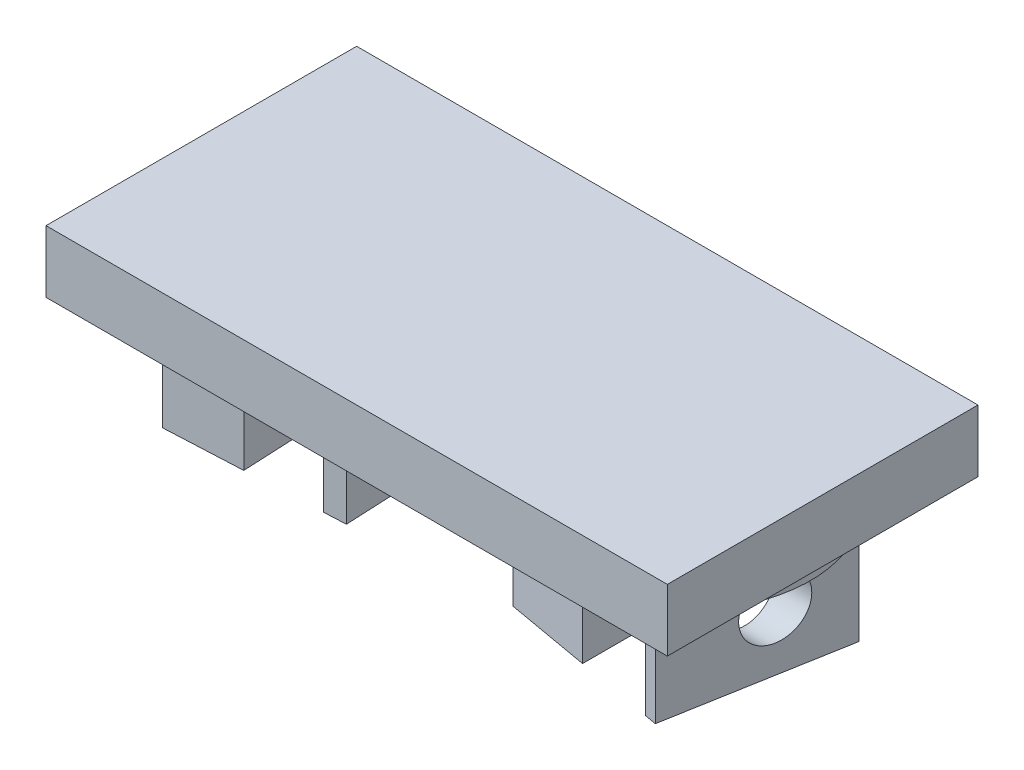
ISO-10303-21;
HEADER;
FILE_DESCRIPTION(('STEP AP214'),'2;1');
FILE_NAME('part.step','',(''),(''),'','','');
FILE_SCHEMA(('AUTOMOTIVE_DESIGN { 1 0 10303 214 1 1 1 1 }'));
ENDSEC;
DATA;
#1=APPLICATION_CONTEXT('core data for automotive mechanical design processes');
#2=APPLICATION_PROTOCOL_DEFINITION('international standard','automotive_design',2000,#1);
#3=PRODUCT_CONTEXT('',#1,'mechanical');
#4=PRODUCT('Part','Part','',(#3));
#5=PRODUCT_RELATED_PRODUCT_CATEGORY('part','',(#4));
#6=PRODUCT_DEFINITION_FORMATION('','',#4);
#7=PRODUCT_DEFINITION_CONTEXT('part definition',#1,'design');
#8=PRODUCT_DEFINITION('design','',#6,#7);
#9=PRODUCT_DEFINITION_SHAPE('','',#8);
#10=(LENGTH_UNIT() NAMED_UNIT(*) SI_UNIT(.MILLI.,.METRE.));
#11=(NAMED_UNIT(*) PLANE_ANGLE_UNIT() SI_UNIT($,.RADIAN.));
#12=(NAMED_UNIT(*) SI_UNIT($,.STERADIAN.) SOLID_ANGLE_UNIT());
#13=UNCERTAINTY_MEASURE_WITH_UNIT(LENGTH_MEASURE(1.E-05),#10,'distance_accuracy_value','');
#14=(GEOMETRIC_REPRESENTATION_CONTEXT(3) GLOBAL_UNCERTAINTY_ASSIGNED_CONTEXT((#13)) GLOBAL_UNIT_ASSIGNED_CONTEXT((#10,
#11,#12)) REPRESENTATION_CONTEXT('',''));
#15=CARTESIAN_POINT('',(0.,0.,0.));
#16=DIRECTION('',(0.,0.,1.));
#17=DIRECTION('',(1.,0.,0.));
#18=AXIS2_PLACEMENT_3D('',#15,#16,#17);
#19=CARTESIAN_POINT('',(-0.784116768757083,-14.5,-16.3224058618479));
#20=DIRECTION('',(0.0479839526443447,0.,0.998848106715243));
#21=DIRECTION('',(0.998848106715243,0.,-0.0479839526443447));
#22=AXIS2_PLACEMENT_3D('',#19,#20,#21);
#23=PLANE('',#22);
#24=DIRECTION('',(0.,-1.,0.));
#25=VECTOR('',#24,1.);
#26=CARTESIAN_POINT('',(31.9470151256708,-13.,-17.8947861589713));
#27=LINE('',#26,#25);
#28=CARTESIAN_POINT('',(31.9470151256708,-13.,-17.8947861589713));
#29=VERTEX_POINT('',#28);
#30=CARTESIAN_POINT('',(31.9470151256708,-29.,-17.8947861589713));
#31=VERTEX_POINT('',#30);
#32=EDGE_CURVE('E209',#29,#31,#27,.T.);
#33=ORIENTED_EDGE('',*,*,#32,.F.);
#34=DIRECTION('',(0.998848106715243,0.,-0.0479839526443447));
#35=VECTOR('',#34,1.);
#36=CARTESIAN_POINT('',(-0.784116768757083,-13.,-16.3224058618479));
#37=LINE('',#36,#35);
#38=CARTESIAN_POINT('',(35.4472498266149,-13.,-18.0629349445625));
#39=VERTEX_POINT('',#38);
#40=EDGE_CURVE('E286',#29,#39,#37,.T.);
#41=ORIENTED_EDGE('',*,*,#40,.T.);
#42=DIRECTION('',(0.,1.,0.));
#43=VECTOR('',#42,1.);
#44=CARTESIAN_POINT('',(35.4472498266149,-14.5,-18.0629349445625));
#45=LINE('',#44,#43);
#46=CARTESIAN_POINT('',(35.4472498266149,-29.,-18.0629349445625));
#47=VERTEX_POINT('',#46);
#48=EDGE_CURVE('E299',#47,#39,#45,.T.);
#49=ORIENTED_EDGE('',*,*,#48,.F.);
#50=DIRECTION('',(0.998848106715243,0.,-0.0479839526443449));
#51=VECTOR('',#50,1.);
#52=CARTESIAN_POINT('',(7.19555904126711,-29.,-16.7057438124444));
#53=LINE('',#52,#51);
#54=EDGE_CURVE('E234',#31,#47,#53,.T.);
#55=ORIENTED_EDGE('',*,*,#54,.F.);
#56=EDGE_LOOP('',(#33,#41,#49,#55));
#57=FACE_BOUND('',#56,.T.);
#58=ADVANCED_FACE('F41',(#57),#23,.F.);
#59=CARTESIAN_POINT('',(36.8044409587329,-29.,10.1887558407852));
#60=DIRECTION('',(-0.0479839526443453,0.,-0.998848106715243));
#61=DIRECTION('',(-0.998848106715243,0.,0.0479839526443453));
#62=AXIS2_PLACEMENT_3D('',#59,#60,#61);
#63=PLANE('',#62);
#64=DIRECTION('',(0.,1.,0.));
#65=VECTOR('',#64,1.);
#66=CARTESIAN_POINT('',(33.3042062577889,-29.,10.3569046263763));
#67=LINE('',#66,#65);
#68=CARTESIAN_POINT('',(33.3042062577889,-29.,10.3569046263763));
#69=VERTEX_POINT('',#68);
#70=CARTESIAN_POINT('',(33.3042062577889,-14.5,10.3569046263763));
#71=VERTEX_POINT('',#70);
#72=EDGE_CURVE('E206',#69,#71,#67,.T.);
#73=ORIENTED_EDGE('',*,*,#72,.F.);
#74=DIRECTION('',(-0.998848106715243,0.,0.0479839526443453));
#75=VECTOR('',#74,1.);
#76=CARTESIAN_POINT('',(36.8044409587329,-29.,10.1887558407852));
#77=LINE('',#76,#75);
#78=CARTESIAN_POINT('',(36.8044409587329,-29.,10.1887558407852));
#79=VERTEX_POINT('',#78);
#80=EDGE_CURVE('E221',#79,#69,#77,.T.);
#81=ORIENTED_EDGE('',*,*,#80,.F.);
#82=DIRECTION('',(0.,1.,0.));
#83=VECTOR('',#82,1.);
#84=CARTESIAN_POINT('',(36.8044409587329,-29.,10.1887558407852));
#85=LINE('',#84,#83);
#86=CARTESIAN_POINT('',(36.8044409587329,-14.5,10.1887558407852));
#87=VERTEX_POINT('',#86);
#88=EDGE_CURVE('E244',#79,#87,#85,.T.);
#89=ORIENTED_EDGE('',*,*,#88,.T.);
#90=DIRECTION('',(-0.998848106715243,0.,0.0479839526443453));
#91=VECTOR('',#90,1.);
#92=CARTESIAN_POINT('',(36.8044409587329,-14.5,10.1887558407852));
#93=LINE('',#92,#91);
#94=EDGE_CURVE('E223',#87,#71,#93,.T.);
#95=ORIENTED_EDGE('',*,*,#94,.T.);
#96=EDGE_LOOP('',(#73,#81,#89,#95));
#97=FACE_BOUND('',#96,.T.);
#98=ADVANCED_FACE('F219',(#97),#63,.F.);
#99=CARTESIAN_POINT('',(0.,-29.,0.));
#100=DIRECTION('',(0.,-1.,0.));
#101=DIRECTION('',(0.,0.,-1.));
#102=AXIS2_PLACEMENT_3D('',#99,#100,#101);
#103=PLANE('',#102);
#104=ORIENTED_EDGE('',*,*,#80,.T.);
#105=DIRECTION('',(0.0479839526443449,0.,0.998848106715243));
#106=VECTOR('',#105,1.);
#107=CARTESIAN_POINT('',(31.9470151256708,-29.,-17.8947861589713));
#108=LINE('',#107,#106);
#109=EDGE_CURVE('E203',#31,#69,#108,.T.);
#110=ORIENTED_EDGE('',*,*,#109,.F.);
#111=ORIENTED_EDGE('',*,*,#54,.T.);
#112=DIRECTION('',(0.047983952644345,0.,0.998848106715243));
#113=VECTOR('',#112,1.);
#114=CARTESIAN_POINT('',(35.4472498266149,-29.,-18.0629349445625));
#115=LINE('',#114,#113);
#116=EDGE_CURVE('E228',#47,#79,#115,.T.);
#117=ORIENTED_EDGE('',*,*,#116,.T.);
#118=EDGE_LOOP('',(#104,#110,#111,#117));
#119=FACE_BOUND('',#118,.T.);
#120=ADVANCED_FACE('F226',(#119),#103,.T.);
#121=CARTESIAN_POINT('',(0.466417402178967,-14.5,-2.63262201240728));
#122=DIRECTION('',(0.174451643781529,0.,-0.984665742260754));
#123=DIRECTION('',(-0.984665742260755,0.,-0.174451643781529));
#124=AXIS2_PLACEMENT_3D('',#121,#122,#123);
#125=PLANE('',#124);
#126=DIRECTION('',(0.,-1.,0.));
#127=VECTOR('',#126,1.);
#128=CARTESIAN_POINT('',(75.22,-14.5,10.6113498280335));
#129=LINE('',#128,#127);
#130=CARTESIAN_POINT('',(75.22,-13.,10.6113498280335));
#131=VERTEX_POINT('',#130);
#132=CARTESIAN_POINT('',(75.22,-29.,10.6113498280335));
#133=VERTEX_POINT('',#132);
#134=EDGE_CURVE('E362',#131,#133,#129,.T.);
#135=ORIENTED_EDGE('',*,*,#134,.F.);
#136=DIRECTION('',(-0.984665742260755,0.,-0.174451643781529));
#137=VECTOR('',#136,1.);
#138=CARTESIAN_POINT('',(0.466417402178967,-13.,-2.63262201240728));
#139=LINE('',#138,#137);
#140=CARTESIAN_POINT('',(61.6076047227655,-13.,8.19966367912247));
#141=VERTEX_POINT('',#140);
#142=EDGE_CURVE('E254',#131,#141,#139,.T.);
#143=ORIENTED_EDGE('',*,*,#142,.T.);
#144=DIRECTION('',(0.,1.,0.));
#145=VECTOR('',#144,1.);
#146=CARTESIAN_POINT('',(61.6076047227655,-14.5,8.19966367912247));
#147=LINE('',#146,#145);
#148=CARTESIAN_POINT('',(61.6076047227655,-29.,8.19966367912247));
#149=VERTEX_POINT('',#148);
#150=EDGE_CURVE('E273',#149,#141,#147,.T.);
#151=ORIENTED_EDGE('',*,*,#150,.F.);
#152=DIRECTION('',(-0.984665742260755,0.,-0.174451643781528));
#153=VECTOR('',#152,1.);
#154=CARTESIAN_POINT('',(89.4581576649522,-29.,13.1339012914048));
#155=LINE('',#154,#153);
#156=EDGE_CURVE('E384',#133,#149,#155,.T.);
#157=ORIENTED_EDGE('',*,*,#156,.F.);
#158=EDGE_LOOP('',(#135,#143,#151,#157));
#159=FACE_BOUND('',#158,.T.);
#160=ADVANCED_FACE('F649',(#159),#125,.F.);
#161=CARTESIAN_POINT('',(6.27649815795352,-14.5,-31.999840083005));
#162=DIRECTION('',(-0.192474103402554,0.,0.981302053151517));
#163=DIRECTION('',(0.981302053151517,0.,0.192474103402554));
#164=AXIS2_PLACEMENT_3D('',#161,#162,#163);
#165=PLANE('',#164);
#166=DIRECTION('',(0.,1.,0.));
#167=VECTOR('',#166,1.);
#168=CARTESIAN_POINT('',(75.22,-14.5,-18.4771549323287));
#169=LINE('',#168,#167);
#170=CARTESIAN_POINT('',(75.22,-29.,-18.4771549323287));
#171=VERTEX_POINT('',#170);
#172=CARTESIAN_POINT('',(75.22,-13.,-18.4771549323287));
#173=VERTEX_POINT('',#172);
#174=EDGE_CURVE('E359',#171,#173,#169,.T.);
#175=ORIENTED_EDGE('',*,*,#174,.F.);
#176=DIRECTION('',(0.981302053151517,0.,0.192474103402554));
#177=VECTOR('',#176,1.);
#178=CARTESIAN_POINT('',(66.1138006423635,-29.,-20.2632589674085));
#179=LINE('',#178,#177);
#180=CARTESIAN_POINT('',(66.1138006423635,-29.,-20.2632589674085));
#181=VERTEX_POINT('',#180);
#182=EDGE_CURVE('E370',#181,#171,#179,.T.);
#183=ORIENTED_EDGE('',*,*,#182,.F.);
#184=DIRECTION('',(0.,1.,0.));
#185=VECTOR('',#184,1.);
#186=CARTESIAN_POINT('',(66.1138006423635,-14.5,-20.2632589674085));
#187=LINE('',#186,#185);
#188=CARTESIAN_POINT('',(66.1138006423635,-13.,-20.2632589674085));
#189=VERTEX_POINT('',#188);
#190=EDGE_CURVE('E270',#181,#189,#187,.T.);
#191=ORIENTED_EDGE('',*,*,#190,.T.);
#192=DIRECTION('',(0.981302053151517,0.,0.192474103402554));
#193=VECTOR('',#192,1.);
#194=CARTESIAN_POINT('',(6.27649815795352,-13.,-31.999840083005));
#195=LINE('',#194,#193);
#196=CARTESIAN_POINT('',(67.1504836630853,-13.,-20.0599223553172));
#197=VERTEX_POINT('',#196);
#198=EDGE_CURVE('E262',#189,#197,#195,.T.);
#199=ORIENTED_EDGE('',*,*,#198,.T.);
#200=EDGE_CURVE('E267',#197,#173,#195,.T.);
#201=ORIENTED_EDGE('',*,*,#200,.T.);
#202=EDGE_LOOP('',(#175,#183,#191,#199,#201));
#203=FACE_BOUND('',#202,.T.);
#204=ADVANCED_FACE('F369',(#203),#165,.F.);
#205=CARTESIAN_POINT('',(0.,-29.,0.));
#206=DIRECTION('',(0.,1.,0.));
#207=DIRECTION('',(0.,0.,1.));
#208=AXIS2_PLACEMENT_3D('',#205,#206,#207);
#209=PLANE('',#208);
#210=DIRECTION('',(0.,0.,-1.));
#211=VECTOR('',#210,1.);
#212=CARTESIAN_POINT('',(75.22,-29.,0.));
#213=LINE('',#212,#211);
#214=EDGE_CURVE('E50',#133,#171,#213,.T.);
#215=ORIENTED_EDGE('',*,*,#214,.F.);
#216=ORIENTED_EDGE('',*,*,#156,.T.);
#217=DIRECTION('',(0.156370546871228,0.,-0.987698462118471));
#218=VECTOR('',#217,1.);
#219=CARTESIAN_POINT('',(61.6076047227655,-29.,8.19966367912247));
#220=LINE('',#219,#218);
#221=EDGE_CURVE('E376',#149,#181,#220,.T.);
#222=ORIENTED_EDGE('',*,*,#221,.T.);
#223=ORIENTED_EDGE('',*,*,#182,.T.);
#224=EDGE_LOOP('',(#215,#216,#222,#223));
#225=FACE_BOUND('',#224,.T.);
#226=ADVANCED_FACE('F374',(#225),#209,.F.);
#227=CARTESIAN_POINT('',(0.,-13.,0.));
#228=DIRECTION('',(0.,-1.,0.));
#229=DIRECTION('',(0.,0.,-1.));
#230=AXIS2_PLACEMENT_3D('',#227,#228,#229);
#231=PLANE('',#230);
#232=DIRECTION('',(-0.174451643781528,0.,0.984665742260755));
#233=VECTOR('',#232,1.);
#234=CARTESIAN_POINT('',(88.9917402627732,-13.,15.7665233038121));
#235=LINE('',#234,#233);
#236=CARTESIAN_POINT('',(94.3923952772345,-13.,-14.7166516507817));
#237=VERTEX_POINT('',#236);
#238=CARTESIAN_POINT('',(89.4581576649522,-13.,13.1339012914048));
#239=VERTEX_POINT('',#238);
#240=EDGE_CURVE('E251',#237,#239,#235,.T.);
#241=ORIENTED_EDGE('',*,*,#240,.F.);
#242=CARTESIAN_POINT('',(78.,-13.,-3.25849398582963));
#243=DIRECTION('',(0.,-1.,0.));
#244=DIRECTION('',(0.,0.,-1.));
#245=AXIS2_PLACEMENT_3D('',#242,#243,#244);
#246=CIRCLE('',#245,20.);
#247=EDGE_CURVE('E306',#237,#239,#246,.T.);
#248=ORIENTED_EDGE('',*,*,#247,.T.);
#249=EDGE_LOOP('',(#241,#248));
#250=FACE_BOUND('',#249,.T.);
#251=ADVANCED_FACE('F524',(#250),#231,.T.);
#252=DIRECTION('',(0.156370546871227,0.,-0.987698462118471));
#253=VECTOR('',#252,1.);
#254=CARTESIAN_POINT('',(61.3676041369093,-13.,9.71560267339416));
#255=LINE('',#254,#253);
#256=CARTESIAN_POINT('',(65.9486051346585,-13.,-19.2198185486477));
#257=VERTEX_POINT('',#256);
#258=EDGE_CURVE('E259',#141,#257,#255,.T.);
#259=ORIENTED_EDGE('',*,*,#258,.F.);
#260=EDGE_CURVE('E815',#141,#257,#246,.T.);
#261=ORIENTED_EDGE('',*,*,#260,.T.);
#262=EDGE_LOOP('',(#259,#261));
#263=FACE_BOUND('',#262,.T.);
#264=ADVANCED_FACE('F518',(#263),#231,.T.);
#265=CARTESIAN_POINT('',(0.,-13.,0.));
#266=DIRECTION('',(0.,-1.,0.));
#267=DIRECTION('',(0.,0.,-1.));
#268=AXIS2_PLACEMENT_3D('',#265,#266,#267);
#269=PLANE('',#268);
#270=CARTESIAN_POINT('',(22.,-13.,-3.25849398582963));
#271=DIRECTION('',(0.,-1.,0.));
#272=DIRECTION('',(0.,0.,-1.));
#273=AXIS2_PLACEMENT_3D('',#270,#271,#272);
#274=CIRCLE('',#273,20.);
#275=CARTESIAN_POINT('',(36.8044409587329,-13.,10.1887558407852));
#276=VERTEX_POINT('',#275);
#277=CARTESIAN_POINT('',(8.55275017338513,-13.,11.5459469729032));
#278=VERTEX_POINT('',#277);
#279=EDGE_CURVE('E318',#276,#278,#274,.T.);
#280=ORIENTED_EDGE('',*,*,#279,.T.);
#281=DIRECTION('',(-1.,0.,0.));
#282=VECTOR('',#281,1.);
#283=CARTESIAN_POINT('',(38.28,-13.,11.5459469729032));
#284=LINE('',#283,#282);
#285=CARTESIAN_POINT('',(14.0534059063514,-13.,11.5459469729032));
#286=VERTEX_POINT('',#285);
#287=EDGE_CURVE('E396',#286,#278,#284,.T.);
#288=ORIENTED_EDGE('',*,*,#287,.F.);
#289=DIRECTION('',(0.998225432651283,0.,-0.0595481788819621));
#290=VECTOR('',#289,1.);
#291=CARTESIAN_POINT('',(0.736153204553354,-13.,12.3403748848396));
#292=LINE('',#291,#290);
#293=EDGE_CURVE('E283',#286,#276,#292,.T.);
#294=ORIENTED_EDGE('',*,*,#293,.T.);
#295=EDGE_LOOP('',(#280,#288,#294));
#296=FACE_BOUND('',#295,.T.);
#297=ADVANCED_FACE('F516',(#296),#269,.T.);
#298=DIRECTION('',(-0.0479839526443449,0.,-0.998848106715243));
#299=VECTOR('',#298,1.);
#300=CARTESIAN_POINT('',(7.9796758100242,-13.,-0.38333795059651));
#301=LINE('',#300,#299);
#302=CARTESIAN_POINT('',(7.19555904126712,-13.,-16.7057438124445));
#303=VERTEX_POINT('',#302);
#304=EDGE_CURVE('E279',#278,#303,#301,.T.);
#305=ORIENTED_EDGE('',*,*,#304,.F.);
#306=EDGE_CURVE('E462',#278,#303,#274,.T.);
#307=ORIENTED_EDGE('',*,*,#306,.T.);
#308=EDGE_LOOP('',(#305,#307));
#309=FACE_BOUND('',#308,.T.);
#310=ADVANCED_FACE('F461',(#309),#269,.T.);
#311=DIRECTION('',(0.047983952644345,0.,0.998848106715243));
#312=VECTOR('',#311,1.);
#313=CARTESIAN_POINT('',(36.231366595372,-13.,-1.74052908271453));
#314=LINE('',#313,#312);
#315=EDGE_CURVE('E290',#39,#276,#314,.T.);
#316=ORIENTED_EDGE('',*,*,#315,.F.);
#317=EDGE_CURVE('E314',#39,#276,#274,.T.);
#318=ORIENTED_EDGE('',*,*,#317,.T.);
#319=EDGE_LOOP('',(#316,#318));
#320=FACE_BOUND('',#319,.T.);
#321=ADVANCED_FACE('F476',(#320),#269,.T.);
#322=CARTESIAN_POINT('',(0.,-10.,21.7415060141704));
#323=DIRECTION('',(-1.,0.,0.));
#324=DIRECTION('',(0.,0.,1.));
#325=AXIS2_PLACEMENT_3D('',#322,#323,#324);
#326=PLANE('',#325);
#327=DIRECTION('',(0.,0.,1.));
#328=VECTOR('',#327,1.);
#329=CARTESIAN_POINT('',(0.,0.,21.7415060141704));
#330=LINE('',#329,#328);
#331=CARTESIAN_POINT('',(0.,0.,-28.2584939858296));
#332=VERTEX_POINT('',#331);
#333=CARTESIAN_POINT('',(0.,0.,21.7415060141704));
#334=VERTEX_POINT('',#333);
#335=EDGE_CURVE('E317',#332,#334,#330,.T.);
#336=ORIENTED_EDGE('',*,*,#335,.F.);
#337=DIRECTION('',(0.,1.,0.));
#338=VECTOR('',#337,1.);
#339=CARTESIAN_POINT('',(0.,-10.,-28.2584939858296));
#340=LINE('',#339,#338);
#341=CARTESIAN_POINT('',(0.,-10.,-28.2584939858296));
#342=VERTEX_POINT('',#341);
#343=EDGE_CURVE('E346',#342,#332,#340,.T.);
#344=ORIENTED_EDGE('',*,*,#343,.F.);
#345=DIRECTION('',(0.,0.,1.));
#346=VECTOR('',#345,1.);
#347=CARTESIAN_POINT('',(0.,-10.,21.7415060141704));
#348=LINE('',#347,#346);
#349=CARTESIAN_POINT('',(0.,-10.,21.7415060141704));
#350=VERTEX_POINT('',#349);
#351=EDGE_CURVE('E322',#342,#350,#348,.T.);
#352=ORIENTED_EDGE('',*,*,#351,.T.);
#353=DIRECTION('',(0.,1.,0.));
#354=VECTOR('',#353,1.);
#355=CARTESIAN_POINT('',(0.,-10.,21.7415060141704));
#356=LINE('',#355,#354);
#357=EDGE_CURVE('E335',#350,#334,#356,.T.);
#358=ORIENTED_EDGE('',*,*,#357,.T.);
#359=EDGE_LOOP('',(#336,#344,#352,#358));
#360=FACE_BOUND('',#359,.T.);
#361=ADVANCED_FACE('F43',(#360),#326,.T.);
#362=CARTESIAN_POINT('',(0.,-10.,-28.2584939858296));
#363=DIRECTION('',(0.,0.,-1.));
#364=DIRECTION('',(-1.,0.,0.));
#365=AXIS2_PLACEMENT_3D('',#362,#363,#364);
#366=PLANE('',#365);
#367=DIRECTION('',(-1.,0.,0.));
#368=VECTOR('',#367,1.);
#369=CARTESIAN_POINT('',(0.,0.,-28.2584939858296));
#370=LINE('',#369,#368);
#371=CARTESIAN_POINT('',(100.,0.,-28.2584939858296));
#372=VERTEX_POINT('',#371);
#373=EDGE_CURVE('E326',#372,#332,#370,.T.);
#374=ORIENTED_EDGE('',*,*,#373,.F.);
#375=DIRECTION('',(0.,1.,0.));
#376=VECTOR('',#375,1.);
#377=CARTESIAN_POINT('',(100.,-10.,-28.2584939858296));
#378=LINE('',#377,#376);
#379=CARTESIAN_POINT('',(100.,-10.,-28.2584939858296));
#380=VERTEX_POINT('',#379);
#381=EDGE_CURVE('E348',#380,#372,#378,.T.);
#382=ORIENTED_EDGE('',*,*,#381,.F.);
#383=DIRECTION('',(-1.,0.,0.));
#384=VECTOR('',#383,1.);
#385=CARTESIAN_POINT('',(0.,-10.,-28.2584939858296));
#386=LINE('',#385,#384);
#387=EDGE_CURVE('E332',#380,#342,#386,.T.);
#388=ORIENTED_EDGE('',*,*,#387,.T.);
#389=ORIENTED_EDGE('',*,*,#343,.T.);
#390=EDGE_LOOP('',(#374,#382,#388,#389));
#391=FACE_BOUND('',#390,.T.);
#392=ADVANCED_FACE('F541',(#391),#366,.T.);
#393=CARTESIAN_POINT('',(100.,-10.,-28.2584939858296));
#394=DIRECTION('',(1.,0.,0.));
#395=DIRECTION('',(0.,0.,-1.));
#396=AXIS2_PLACEMENT_3D('',#393,#394,#395);
#397=PLANE('',#396);
#398=DIRECTION('',(0.,0.,-1.));
#399=VECTOR('',#398,1.);
#400=CARTESIAN_POINT('',(100.,0.,-28.2584939858296));
#401=LINE('',#400,#399);
#402=CARTESIAN_POINT('',(100.,0.,21.7415060141704));
#403=VERTEX_POINT('',#402);
#404=EDGE_CURVE('E341',#403,#372,#401,.T.);
#405=ORIENTED_EDGE('',*,*,#404,.F.);
#406=DIRECTION('',(0.,1.,0.));
#407=VECTOR('',#406,1.);
#408=CARTESIAN_POINT('',(100.,-10.,21.7415060141704));
#409=LINE('',#408,#407);
#410=CARTESIAN_POINT('',(100.,-10.,21.7415060141704));
#411=VERTEX_POINT('',#410);
#412=EDGE_CURVE('E350',#411,#403,#409,.T.);
#413=ORIENTED_EDGE('',*,*,#412,.F.);
#414=DIRECTION('',(0.,0.,-1.));
#415=VECTOR('',#414,1.);
#416=CARTESIAN_POINT('',(100.,-10.,-28.2584939858296));
#417=LINE('',#416,#415);
#418=EDGE_CURVE('E329',#411,#380,#417,.T.);
#419=ORIENTED_EDGE('',*,*,#418,.T.);
#420=ORIENTED_EDGE('',*,*,#381,.T.);
#421=EDGE_LOOP('',(#405,#413,#419,#420));
#422=FACE_BOUND('',#421,.T.);
#423=ADVANCED_FACE('F546',(#422),#397,.T.);
#424=CARTESIAN_POINT('',(100.,-10.,21.7415060141704));
#425=DIRECTION('',(0.,0.,1.));
#426=DIRECTION('',(1.,0.,0.));
#427=AXIS2_PLACEMENT_3D('',#424,#425,#426);
#428=PLANE('',#427);
#429=DIRECTION('',(1.,0.,0.));
#430=VECTOR('',#429,1.);
#431=CARTESIAN_POINT('',(100.,0.,21.7415060141704));
#432=LINE('',#431,#430);
#433=EDGE_CURVE('E338',#334,#403,#432,.T.);
#434=ORIENTED_EDGE('',*,*,#433,.F.);
#435=ORIENTED_EDGE('',*,*,#357,.F.);
#436=DIRECTION('',(1.,0.,0.));
#437=VECTOR('',#436,1.);
#438=CARTESIAN_POINT('',(100.,-10.,21.7415060141704));
#439=LINE('',#438,#437);
#440=EDGE_CURVE('E325',#350,#411,#439,.T.);
#441=ORIENTED_EDGE('',*,*,#440,.T.);
#442=ORIENTED_EDGE('',*,*,#412,.T.);
#443=EDGE_LOOP('',(#434,#435,#441,#442));
#444=FACE_BOUND('',#443,.T.);
#445=ADVANCED_FACE('F561',(#444),#428,.T.);
#446=CARTESIAN_POINT('',(0.,-10.,0.));
#447=DIRECTION('',(0.,-1.,0.));
#448=DIRECTION('',(0.,0.,-1.));
#449=AXIS2_PLACEMENT_3D('',#446,#447,#448);
#450=PLANE('',#449);
#451=CARTESIAN_POINT('',(78.,-10.,-3.25849398582963));
#452=DIRECTION('',(0.,-1.,0.));
#453=DIRECTION('',(0.,0.,-1.));
#454=AXIS2_PLACEMENT_3D('',#451,#452,#453);
#455=CIRCLE('',#454,20.);
#456=CARTESIAN_POINT('',(78.,-10.,-23.2584939858296));
#457=VERTEX_POINT('',#456);
#458=EDGE_CURVE('E305',#457,#457,#455,.T.);
#459=ORIENTED_EDGE('',*,*,#458,.F.);
#460=EDGE_LOOP('',(#459));
#461=FACE_BOUND('',#460,.T.);
#462=CARTESIAN_POINT('',(22.,-10.,-3.25849398582963));
#463=DIRECTION('',(0.,-1.,0.));
#464=DIRECTION('',(0.,0.,-1.));
#465=AXIS2_PLACEMENT_3D('',#462,#463,#464);
#466=CIRCLE('',#465,20.);
#467=CARTESIAN_POINT('',(22.,-10.,-23.2584939858296));
#468=VERTEX_POINT('',#467);
#469=EDGE_CURVE('E309',#468,#468,#466,.T.);
#470=ORIENTED_EDGE('',*,*,#469,.F.);
#471=EDGE_LOOP('',(#470));
#472=FACE_BOUND('',#471,.T.);
#473=ORIENTED_EDGE('',*,*,#351,.F.);
#474=ORIENTED_EDGE('',*,*,#387,.F.);
#475=ORIENTED_EDGE('',*,*,#418,.F.);
#476=ORIENTED_EDGE('',*,*,#440,.F.);
#477=EDGE_LOOP('',(#473,#474,#475,#476));
#478=FACE_BOUND('',#477,.T.);
#479=ADVANCED_FACE('F558',(#461,#472,#478),#450,.T.);
#480=CARTESIAN_POINT('',(0.,0.,0.));
#481=DIRECTION('',(0.,-1.,0.));
#482=DIRECTION('',(0.,0.,-1.));
#483=AXIS2_PLACEMENT_3D('',#480,#481,#482);
#484=PLANE('',#483);
#485=ORIENTED_EDGE('',*,*,#335,.T.);
#486=ORIENTED_EDGE('',*,*,#433,.T.);
#487=ORIENTED_EDGE('',*,*,#404,.T.);
#488=ORIENTED_EDGE('',*,*,#373,.T.);
#489=EDGE_LOOP('',(#485,#486,#487,#488));
#490=FACE_BOUND('',#489,.T.);
#491=ADVANCED_FACE('F536',(#490),#484,.F.);
#492=CARTESIAN_POINT('',(22.,-13.,-3.25849398582963));
#493=DIRECTION('',(0.,1.,0.));
#494=DIRECTION('',(0.,0.,1.));
#495=AXIS2_PLACEMENT_3D('',#492,#493,#494);
#496=CYLINDRICAL_SURFACE('',#495,20.);
#497=ORIENTED_EDGE('',*,*,#306,.F.);
#498=ORIENTED_EDGE('',*,*,#279,.F.);
#499=ORIENTED_EDGE('',*,*,#317,.F.);
#500=EDGE_CURVE('E319',#303,#39,#274,.T.);
#501=ORIENTED_EDGE('',*,*,#500,.F.);
#502=EDGE_LOOP('',(#497,#498,#499,#501));
#503=FACE_BOUND('',#502,.T.);
#504=ORIENTED_EDGE('',*,*,#469,.T.);
#505=EDGE_LOOP('',(#504));
#506=FACE_BOUND('',#505,.T.);
#507=ADVANCED_FACE('F466',(#503,#506),#496,.T.);
#508=CARTESIAN_POINT('',(19.6811603752077,-13.,-17.3055432204988));
#509=VERTEX_POINT('',#508);
#510=EDGE_CURVE('E287',#303,#509,#37,.T.);
#511=ORIENTED_EDGE('',*,*,#510,.F.);
#512=ORIENTED_EDGE('',*,*,#500,.T.);
#513=ORIENTED_EDGE('',*,*,#40,.F.);
#514=DIRECTION('',(-0.0479839526443449,0.,-0.998848106715243));
#515=VECTOR('',#514,1.);
#516=CARTESIAN_POINT('',(33.3042062577889,-13.,10.3569046263763));
#517=LINE('',#516,#515);
#518=CARTESIAN_POINT('',(33.3042062577889,-13.,10.3569046263763));
#519=VERTEX_POINT('',#518);
#520=EDGE_CURVE('E224',#519,#29,#517,.T.);
#521=ORIENTED_EDGE('',*,*,#520,.F.);
#522=DIRECTION('',(-0.998848106715243,0.,0.0479839526443449));
#523=VECTOR('',#522,1.);
#524=CARTESIAN_POINT('',(33.3042062577889,-13.,10.3569046263763));
#525=LINE('',#524,#523);
#526=CARTESIAN_POINT('',(21.0383515073257,-13.,10.9461475648489));
#527=VERTEX_POINT('',#526);
#528=EDGE_CURVE('E401',#519,#527,#525,.T.);
#529=ORIENTED_EDGE('',*,*,#528,.T.);
#530=DIRECTION('',(-0.0479839526443449,0.,-0.998848106715243));
#531=VECTOR('',#530,1.);
#532=CARTESIAN_POINT('',(21.0383515073257,-13.,10.9461475648489));
#533=LINE('',#532,#531);
#534=EDGE_CURVE('E406',#527,#509,#533,.T.);
#535=ORIENTED_EDGE('',*,*,#534,.T.);
#536=EDGE_LOOP('',(#511,#512,#513,#521,#529,#535));
#537=FACE_BOUND('',#536,.T.);
#538=ADVANCED_FACE('F473',(#537),#269,.T.);
#539=CARTESIAN_POINT('',(78.,-13.,-3.25849398582963));
#540=DIRECTION('',(0.,1.,0.));
#541=DIRECTION('',(0.,0.,1.));
#542=AXIS2_PLACEMENT_3D('',#539,#540,#541);
#543=CYLINDRICAL_SURFACE('',#542,20.);
#544=ORIENTED_EDGE('',*,*,#247,.F.);
#545=EDGE_CURVE('E311',#197,#237,#246,.T.);
#546=ORIENTED_EDGE('',*,*,#545,.F.);
#547=EDGE_CURVE('E820',#257,#197,#246,.T.);
#548=ORIENTED_EDGE('',*,*,#547,.F.);
#549=ORIENTED_EDGE('',*,*,#260,.F.);
#550=EDGE_CURVE('E310',#239,#141,#246,.T.);
#551=ORIENTED_EDGE('',*,*,#550,.F.);
#552=EDGE_LOOP('',(#544,#546,#548,#549,#551));
#553=FACE_BOUND('',#552,.T.);
#554=ORIENTED_EDGE('',*,*,#458,.T.);
#555=EDGE_LOOP('',(#554));
#556=FACE_BOUND('',#555,.T.);
#557=ADVANCED_FACE('F530',(#553,#556),#543,.T.);
#558=DIRECTION('',(0.,0.,1.));
#559=VECTOR('',#558,1.);
#560=CARTESIAN_POINT('',(75.22,-13.,-20.2632589674085));
#561=LINE('',#560,#559);
#562=EDGE_CURVE('E389',#173,#131,#561,.T.);
#563=ORIENTED_EDGE('',*,*,#562,.F.);
#564=ORIENTED_EDGE('',*,*,#200,.F.);
#565=ORIENTED_EDGE('',*,*,#545,.T.);
#566=CARTESIAN_POINT('',(87.5,-13.,-16.0685367273707));
#567=VERTEX_POINT('',#566);
#568=EDGE_CURVE('E266',#567,#237,#195,.T.);
#569=ORIENTED_EDGE('',*,*,#568,.F.);
#570=DIRECTION('',(0.,0.,1.));
#571=VECTOR('',#570,1.);
#572=CARTESIAN_POINT('',(87.5,-13.,-20.2632589674085));
#573=LINE('',#572,#571);
#574=CARTESIAN_POINT('',(87.5,-13.,12.7869776514598));
#575=VERTEX_POINT('',#574);
#576=EDGE_CURVE('E390',#567,#575,#573,.T.);
#577=ORIENTED_EDGE('',*,*,#576,.T.);
#578=EDGE_CURVE('E255',#239,#575,#139,.T.);
#579=ORIENTED_EDGE('',*,*,#578,.F.);
#580=ORIENTED_EDGE('',*,*,#550,.T.);
#581=ORIENTED_EDGE('',*,*,#142,.F.);
#582=EDGE_LOOP('',(#563,#564,#565,#569,#577,#579,#580,#581));
#583=FACE_BOUND('',#582,.T.);
#584=ADVANCED_FACE('F453',(#583),#231,.T.);
#585=CARTESIAN_POINT('',(7.9796758100242,-14.5,-0.38333795059651));
#586=DIRECTION('',(0.998848106715243,0.,-0.0479839526443449));
#587=DIRECTION('',(-0.0479839526443449,0.,-0.998848106715243));
#588=AXIS2_PLACEMENT_3D('',#585,#586,#587);
#589=PLANE('',#588);
#590=CARTESIAN_POINT('',(7.84155535896441,-19.5,-3.25849398582964));
#591=DIRECTION('',(0.998848106715243,0.,-0.0479839526443449));
#592=DIRECTION('',(-0.0479839526443449,0.,-0.998848106715243));
#593=AXIS2_PLACEMENT_3D('',#590,#591,#592);
#594=ELLIPSE('',#593,5.00576610836529,5.);
#595=CARTESIAN_POINT('',(7.60135891507195,-19.5,-8.25849398582964));
#596=VERTEX_POINT('',#595);
#597=EDGE_CURVE('E412',#596,#596,#594,.T.);
#598=ORIENTED_EDGE('',*,*,#597,.T.);
#599=EDGE_LOOP('',(#598));
#600=FACE_BOUND('',#599,.T.);
#601=ORIENTED_EDGE('',*,*,#304,.T.);
#602=DIRECTION('',(0.,1.,0.));
#603=VECTOR('',#602,1.);
#604=CARTESIAN_POINT('',(7.19555904126711,-14.5,-16.7057438124444));
#605=LINE('',#604,#603);
#606=CARTESIAN_POINT('',(7.19555904126711,-29.,-16.7057438124444));
#607=VERTEX_POINT('',#606);
#608=EDGE_CURVE('E302',#607,#303,#605,.T.);
#609=ORIENTED_EDGE('',*,*,#608,.F.);
#610=DIRECTION('',(-0.0479839526443449,0.,-0.998848106715243));
#611=VECTOR('',#610,1.);
#612=CARTESIAN_POINT('',(8.55275017338513,-29.,11.5459469729032));
#613=LINE('',#612,#611);
#614=CARTESIAN_POINT('',(8.55275017338513,-29.,11.5459469729032));
#615=VERTEX_POINT('',#614);
#616=EDGE_CURVE('E230',#615,#607,#613,.T.);
#617=ORIENTED_EDGE('',*,*,#616,.F.);
#618=DIRECTION('',(0.,1.,0.));
#619=VECTOR('',#618,1.);
#620=CARTESIAN_POINT('',(8.55275017338513,-29.,11.5459469729032));
#621=LINE('',#620,#619);
#622=CARTESIAN_POINT('',(8.55275017338513,-14.5,11.5459469729032));
#623=VERTEX_POINT('',#622);
#624=EDGE_CURVE('E248',#615,#623,#621,.T.);
#625=ORIENTED_EDGE('',*,*,#624,.T.);
#626=DIRECTION('',(0.,1.,0.));
#627=VECTOR('',#626,1.);
#628=CARTESIAN_POINT('',(8.55275017338513,-14.5,11.5459469729032));
#629=LINE('',#628,#627);
#630=EDGE_CURVE('E282',#623,#278,#629,.T.);
#631=ORIENTED_EDGE('',*,*,#630,.T.);
#632=EDGE_LOOP('',(#601,#609,#617,#625,#631));
#633=FACE_BOUND('',#632,.T.);
#634=ADVANCED_FACE('F449',(#600,#633),#589,.F.);
#635=ORIENTED_EDGE('',*,*,#510,.T.);
#636=DIRECTION('',(0.,-1.,0.));
#637=VECTOR('',#636,1.);
#638=CARTESIAN_POINT('',(19.6811603752077,-13.,-17.3055432204988));
#639=LINE('',#638,#637);
#640=CARTESIAN_POINT('',(19.6811603752077,-29.,-17.3055432204988));
#641=VERTEX_POINT('',#640);
#642=EDGE_CURVE('E214',#509,#641,#639,.T.);
#643=ORIENTED_EDGE('',*,*,#642,.T.);
#644=EDGE_CURVE('E240',#607,#641,#53,.T.);
#645=ORIENTED_EDGE('',*,*,#644,.F.);
#646=ORIENTED_EDGE('',*,*,#608,.T.);
#647=EDGE_LOOP('',(#635,#643,#645,#646));
#648=FACE_BOUND('',#647,.T.);
#649=ADVANCED_FACE('F452',(#648),#23,.F.);
#650=CARTESIAN_POINT('',(36.231366595372,-14.5,-1.74052908271453));
#651=DIRECTION('',(-0.998848106715243,0.,0.047983952644345));
#652=DIRECTION('',(0.047983952644345,0.,0.998848106715243));
#653=AXIS2_PLACEMENT_3D('',#650,#651,#652);
#654=PLANE('',#653);
#655=CARTESIAN_POINT('',(36.1584446410356,-19.5,-3.25849398582964));
#656=DIRECTION('',(-0.998848106715243,0.,0.047983952644345));
#657=DIRECTION('',(-0.047983952644345,0.,-0.998848106715243));
#658=AXIS2_PLACEMENT_3D('',#655,#656,#657);
#659=ELLIPSE('',#658,5.00576610836529,5.);
#660=CARTESIAN_POINT('',(35.9182481971431,-19.5,-8.25849398582964));
#661=VERTEX_POINT('',#660);
#662=EDGE_CURVE('E417',#661,#661,#659,.T.);
#663=ORIENTED_EDGE('',*,*,#662,.T.);
#664=EDGE_LOOP('',(#663));
#665=FACE_BOUND('',#664,.T.);
#666=ORIENTED_EDGE('',*,*,#315,.T.);
#667=DIRECTION('',(0.,1.,0.));
#668=VECTOR('',#667,1.);
#669=CARTESIAN_POINT('',(36.8044409587329,-14.5,10.1887558407852));
#670=LINE('',#669,#668);
#671=EDGE_CURVE('E296',#87,#276,#670,.T.);
#672=ORIENTED_EDGE('',*,*,#671,.F.);
#673=ORIENTED_EDGE('',*,*,#88,.F.);
#674=ORIENTED_EDGE('',*,*,#116,.F.);
#675=ORIENTED_EDGE('',*,*,#48,.T.);
#676=EDGE_LOOP('',(#666,#672,#673,#674,#675));
#677=FACE_BOUND('',#676,.T.);
#678=ADVANCED_FACE('F480',(#665,#677),#654,.F.);
#679=CARTESIAN_POINT('',(0.736153204553354,-14.5,12.3403748848396));
#680=DIRECTION('',(0.059548178881962,0.,0.998225432651283));
#681=DIRECTION('',(0.998225432651283,0.,-0.059548178881962));
#682=AXIS2_PLACEMENT_3D('',#679,#680,#681);
#683=PLANE('',#682);
#684=DIRECTION('',(0.,1.,0.));
#685=VECTOR('',#684,1.);
#686=CARTESIAN_POINT('',(14.0534059063514,-14.5,11.5459469729032));
#687=LINE('',#686,#685);
#688=CARTESIAN_POINT('',(14.0534059063515,-14.5,11.5459469729032));
#689=VERTEX_POINT('',#688);
#690=EDGE_CURVE('E393',#689,#286,#687,.T.);
#691=ORIENTED_EDGE('',*,*,#690,.F.);
#692=DIRECTION('',(0.998225432651283,0.,-0.0595481788819621));
#693=VECTOR('',#692,1.);
#694=CARTESIAN_POINT('',(0.736153204553354,-14.5,12.3403748848396));
#695=LINE('',#694,#693);
#696=EDGE_CURVE('E280',#689,#87,#695,.T.);
#697=ORIENTED_EDGE('',*,*,#696,.T.);
#698=ORIENTED_EDGE('',*,*,#671,.T.);
#699=ORIENTED_EDGE('',*,*,#293,.F.);
#700=EDGE_LOOP('',(#691,#697,#698,#699));
#701=FACE_BOUND('',#700,.T.);
#702=ADVANCED_FACE('F495',(#701),#683,.T.);
#703=CARTESIAN_POINT('',(0.,-14.5,0.));
#704=DIRECTION('',(0.,-1.,0.));
#705=DIRECTION('',(0.,0.,-1.));
#706=AXIS2_PLACEMENT_3D('',#703,#704,#705);
#707=PLANE('',#706);
#708=DIRECTION('',(1.,0.,0.));
#709=VECTOR('',#708,1.);
#710=CARTESIAN_POINT('',(0.,-14.5,11.5459469729032));
#711=LINE('',#710,#709);
#712=EDGE_CURVE('E11',#623,#689,#711,.T.);
#713=ORIENTED_EDGE('',*,*,#712,.F.);
#714=CARTESIAN_POINT('',(21.0383515073257,-14.5,10.9461475648489));
#715=VERTEX_POINT('',#714);
#716=EDGE_CURVE('E246',#715,#623,#93,.T.);
#717=ORIENTED_EDGE('',*,*,#716,.F.);
#718=DIRECTION('',(-0.998848106715243,0.,0.0479839526443449));
#719=VECTOR('',#718,1.);
#720=CARTESIAN_POINT('',(0.57307436336093,-14.5,11.9292849234997));
#721=LINE('',#720,#719);
#722=EDGE_CURVE('E399',#71,#715,#721,.T.);
#723=ORIENTED_EDGE('',*,*,#722,.F.);
#724=ORIENTED_EDGE('',*,*,#94,.F.);
#725=ORIENTED_EDGE('',*,*,#696,.F.);
#726=EDGE_LOOP('',(#713,#717,#723,#724,#725));
#727=FACE_BOUND('',#726,.T.);
#728=ADVANCED_FACE('F512',(#727),#707,.T.);
#729=CARTESIAN_POINT('',(0.,-13.,0.));
#730=DIRECTION('',(0.,-1.,0.));
#731=DIRECTION('',(0.,0.,-1.));
#732=AXIS2_PLACEMENT_3D('',#729,#730,#731);
#733=PLANE('',#732);
#734=EDGE_CURVE('E258',#257,#189,#255,.T.);
#735=ORIENTED_EDGE('',*,*,#734,.F.);
#736=ORIENTED_EDGE('',*,*,#547,.T.);
#737=ORIENTED_EDGE('',*,*,#198,.F.);
#738=EDGE_LOOP('',(#735,#736,#737));
#739=FACE_BOUND('',#738,.T.);
#740=ADVANCED_FACE('F669',(#739),#733,.F.);
#741=CARTESIAN_POINT('',(88.9917402627732,-14.5,15.7665233038121));
#742=DIRECTION('',(-0.984665742260755,0.,-0.174451643781528));
#743=DIRECTION('',(-0.174451643781528,0.,0.984665742260755));
#744=AXIS2_PLACEMENT_3D('',#741,#742,#743);
#745=PLANE('',#744);
#746=CARTESIAN_POINT('',(92.3623719367561,-19.5,-3.25849398582964));
#747=DIRECTION('',(-0.984665742260755,0.,-0.174451643781528));
#748=DIRECTION('',(-0.174451643781528,0.,0.984665742260755));
#749=AXIS2_PLACEMENT_3D('',#746,#747,#748);
#750=ELLIPSE('',#749,5.0778652952018,5.);
#751=CARTESIAN_POINT('',(91.476529989107,-19.5,1.74150601417036));
#752=VERTEX_POINT('',#751);
#753=EDGE_CURVE('E420',#752,#752,#750,.T.);
#754=ORIENTED_EDGE('',*,*,#753,.T.);
#755=EDGE_LOOP('',(#754));
#756=FACE_BOUND('',#755,.T.);
#757=ORIENTED_EDGE('',*,*,#240,.T.);
#758=DIRECTION('',(0.,1.,0.));
#759=VECTOR('',#758,1.);
#760=CARTESIAN_POINT('',(89.4581576649522,-14.5,13.1339012914048));
#761=LINE('',#760,#759);
#762=CARTESIAN_POINT('',(89.4581576649522,-29.,13.1339012914048));
#763=VERTEX_POINT('',#762);
#764=EDGE_CURVE('E276',#763,#239,#761,.T.);
#765=ORIENTED_EDGE('',*,*,#764,.F.);
#766=DIRECTION('',(-0.174451643781528,0.,0.984665742260755));
#767=VECTOR('',#766,1.);
#768=CARTESIAN_POINT('',(94.3923952772345,-29.,-14.7166516507817));
#769=LINE('',#768,#767);
#770=CARTESIAN_POINT('',(94.3923952772345,-29.,-14.7166516507817));
#771=VERTEX_POINT('',#770);
#772=EDGE_CURVE('E237',#771,#763,#769,.T.);
#773=ORIENTED_EDGE('',*,*,#772,.F.);
#774=DIRECTION('',(0.,1.,0.));
#775=VECTOR('',#774,1.);
#776=CARTESIAN_POINT('',(94.3923952772345,-14.5,-14.7166516507817));
#777=LINE('',#776,#775);
#778=EDGE_CURVE('E265',#771,#237,#777,.T.);
#779=ORIENTED_EDGE('',*,*,#778,.T.);
#780=EDGE_LOOP('',(#757,#765,#773,#779));
#781=FACE_BOUND('',#780,.T.);
#782=ADVANCED_FACE('F706',(#756,#781),#745,.F.);
#783=ORIENTED_EDGE('',*,*,#578,.T.);
#784=DIRECTION('',(0.,-1.,0.));
#785=VECTOR('',#784,1.);
#786=CARTESIAN_POINT('',(87.5,-14.5,12.7869776514598));
#787=LINE('',#786,#785);
#788=CARTESIAN_POINT('',(87.5,-29.,12.7869776514598));
#789=VERTEX_POINT('',#788);
#790=EDGE_CURVE('E371',#575,#789,#787,.T.);
#791=ORIENTED_EDGE('',*,*,#790,.T.);
#792=EDGE_CURVE('E381',#763,#789,#155,.T.);
#793=ORIENTED_EDGE('',*,*,#792,.F.);
#794=ORIENTED_EDGE('',*,*,#764,.T.);
#795=EDGE_LOOP('',(#783,#791,#793,#794));
#796=FACE_BOUND('',#795,.T.);
#797=ADVANCED_FACE('F711',(#796),#125,.F.);
#798=CARTESIAN_POINT('',(61.3676041369093,-14.5,9.71560267339416));
#799=DIRECTION('',(0.987698462118471,0.,0.156370546871227));
#800=DIRECTION('',(0.156370546871227,0.,-0.987698462118471));
#801=AXIS2_PLACEMENT_3D('',#798,#799,#800);
#802=PLANE('',#801);
#803=CARTESIAN_POINT('',(63.421638508302,-19.5,-3.25849398582964));
#804=DIRECTION('',(0.987698462118471,0.,0.156370546871227));
#805=DIRECTION('',(-0.156370546871227,0.,0.987698462118471));
#806=AXIS2_PLACEMENT_3D('',#803,#804,#805);
#807=ELLIPSE('',#806,5.06227375233097,5.);
#808=CARTESIAN_POINT('',(62.6300479932381,-19.5,1.74150601417036));
#809=VERTEX_POINT('',#808);
#810=EDGE_CURVE('E423',#809,#809,#807,.T.);
#811=ORIENTED_EDGE('',*,*,#810,.T.);
#812=EDGE_LOOP('',(#811));
#813=FACE_BOUND('',#812,.T.);
#814=ORIENTED_EDGE('',*,*,#258,.T.);
#815=ORIENTED_EDGE('',*,*,#734,.T.);
#816=ORIENTED_EDGE('',*,*,#190,.F.);
#817=ORIENTED_EDGE('',*,*,#221,.F.);
#818=ORIENTED_EDGE('',*,*,#150,.T.);
#819=EDGE_LOOP('',(#814,#815,#816,#817,#818));
#820=FACE_BOUND('',#819,.T.);
#821=ADVANCED_FACE('F720',(#813,#820),#802,.F.);
#822=CARTESIAN_POINT('',(87.5,-29.,-16.0685367273708));
#823=VERTEX_POINT('',#822);
#824=EDGE_CURVE('E377',#823,#771,#179,.T.);
#825=ORIENTED_EDGE('',*,*,#824,.F.);
#826=DIRECTION('',(0.,1.,0.));
#827=VECTOR('',#826,1.);
#828=CARTESIAN_POINT('',(87.5,-14.5,-16.0685367273707));
#829=LINE('',#828,#827);
#830=EDGE_CURVE('E65',#823,#567,#829,.T.);
#831=ORIENTED_EDGE('',*,*,#830,.T.);
#832=ORIENTED_EDGE('',*,*,#568,.T.);
#833=ORIENTED_EDGE('',*,*,#778,.F.);
#834=EDGE_LOOP('',(#825,#831,#832,#833));
#835=FACE_BOUND('',#834,.T.);
#836=ADVANCED_FACE('F681',(#835),#165,.F.);
#837=CARTESIAN_POINT('',(21.0383515073257,-29.,10.9461475648489));
#838=VERTEX_POINT('',#837);
#839=EDGE_CURVE('E231',#838,#615,#77,.T.);
#840=ORIENTED_EDGE('',*,*,#839,.F.);
#841=DIRECTION('',(0.,1.,0.));
#842=VECTOR('',#841,1.);
#843=CARTESIAN_POINT('',(21.0383515073257,-29.,10.9461475648489));
#844=LINE('',#843,#842);
#845=EDGE_CURVE('E57',#838,#715,#844,.T.);
#846=ORIENTED_EDGE('',*,*,#845,.T.);
#847=ORIENTED_EDGE('',*,*,#716,.T.);
#848=ORIENTED_EDGE('',*,*,#624,.F.);
#849=EDGE_LOOP('',(#840,#846,#847,#848));
#850=FACE_BOUND('',#849,.T.);
#851=ADVANCED_FACE('F488',(#850),#63,.F.);
#852=DIRECTION('',(0.0479839526443449,0.,0.998848106715243));
#853=VECTOR('',#852,1.);
#854=CARTESIAN_POINT('',(19.6811603752077,-29.,-17.3055432204988));
#855=LINE('',#854,#853);
#856=EDGE_CURVE('E410',#641,#838,#855,.T.);
#857=ORIENTED_EDGE('',*,*,#856,.T.);
#858=ORIENTED_EDGE('',*,*,#839,.T.);
#859=ORIENTED_EDGE('',*,*,#616,.T.);
#860=ORIENTED_EDGE('',*,*,#644,.T.);
#861=EDGE_LOOP('',(#857,#858,#859,#860));
#862=FACE_BOUND('',#861,.T.);
#863=ADVANCED_FACE('F500',(#862),#103,.T.);
#864=ORIENTED_EDGE('',*,*,#792,.T.);
#865=DIRECTION('',(0.,0.,-1.));
#866=VECTOR('',#865,1.);
#867=CARTESIAN_POINT('',(87.5,-29.,0.));
#868=LINE('',#867,#866);
#869=EDGE_CURVE('E353',#789,#823,#868,.T.);
#870=ORIENTED_EDGE('',*,*,#869,.T.);
#871=ORIENTED_EDGE('',*,*,#824,.T.);
#872=ORIENTED_EDGE('',*,*,#772,.T.);
#873=EDGE_LOOP('',(#864,#870,#871,#872));
#874=FACE_BOUND('',#873,.T.);
#875=ADVANCED_FACE('F691',(#874),#209,.F.);
#876=CARTESIAN_POINT('',(75.22,0.,0.));
#877=DIRECTION('',(1.,0.,0.));
#878=DIRECTION('',(0.,0.,-1.));
#879=AXIS2_PLACEMENT_3D('',#876,#877,#878);
#880=PLANE('',#879);
#881=CARTESIAN_POINT('',(75.22,-19.5,-3.25849398582964));
#882=DIRECTION('',(1.,0.,0.));
#883=DIRECTION('',(0.,0.,-1.));
#884=AXIS2_PLACEMENT_3D('',#881,#882,#883);
#885=CIRCLE('',#884,5.);
#886=CARTESIAN_POINT('',(75.22,-19.5,-8.25849398582964));
#887=VERTEX_POINT('',#886);
#888=EDGE_CURVE('E426',#887,#887,#885,.T.);
#889=ORIENTED_EDGE('',*,*,#888,.F.);
#890=EDGE_LOOP('',(#889));
#891=FACE_BOUND('',#890,.T.);
#892=ORIENTED_EDGE('',*,*,#134,.T.);
#893=ORIENTED_EDGE('',*,*,#214,.T.);
#894=ORIENTED_EDGE('',*,*,#174,.T.);
#895=ORIENTED_EDGE('',*,*,#562,.T.);
#896=EDGE_LOOP('',(#892,#893,#894,#895));
#897=FACE_BOUND('',#896,.T.);
#898=ADVANCED_FACE('F358',(#891,#897),#880,.T.);
#899=CARTESIAN_POINT('',(87.5,0.,0.));
#900=DIRECTION('',(1.,0.,0.));
#901=DIRECTION('',(0.,0.,-1.));
#902=AXIS2_PLACEMENT_3D('',#899,#900,#901);
#903=PLANE('',#902);
#904=CARTESIAN_POINT('',(87.5,-19.5,-3.25849398582964));
#905=DIRECTION('',(1.,0.,0.));
#906=DIRECTION('',(0.,0.,-1.));
#907=AXIS2_PLACEMENT_3D('',#904,#905,#906);
#908=CIRCLE('',#907,5.);
#909=CARTESIAN_POINT('',(87.5,-19.5,-8.25849398582964));
#910=VERTEX_POINT('',#909);
#911=EDGE_CURVE('E429',#910,#910,#908,.T.);
#912=ORIENTED_EDGE('',*,*,#911,.T.);
#913=EDGE_LOOP('',(#912));
#914=FACE_BOUND('',#913,.T.);
#915=ORIENTED_EDGE('',*,*,#576,.F.);
#916=ORIENTED_EDGE('',*,*,#830,.F.);
#917=ORIENTED_EDGE('',*,*,#869,.F.);
#918=ORIENTED_EDGE('',*,*,#790,.F.);
#919=EDGE_LOOP('',(#915,#916,#917,#918));
#920=FACE_BOUND('',#919,.T.);
#921=ADVANCED_FACE('F625',(#914,#920),#903,.F.);
#922=CARTESIAN_POINT('',(38.28,-13.,11.5459469729032));
#923=DIRECTION('',(0.,0.,-1.));
#924=DIRECTION('',(-1.,0.,0.));
#925=AXIS2_PLACEMENT_3D('',#922,#923,#924);
#926=PLANE('',#925);
#927=ORIENTED_EDGE('',*,*,#712,.T.);
#928=ORIENTED_EDGE('',*,*,#690,.T.);
#929=ORIENTED_EDGE('',*,*,#287,.T.);
#930=ORIENTED_EDGE('',*,*,#630,.F.);
#931=EDGE_LOOP('',(#927,#928,#929,#930));
#932=FACE_BOUND('',#931,.T.);
#933=ADVANCED_FACE('F508',(#932),#926,.F.);
#934=CARTESIAN_POINT('',(33.3042062577889,-29.,10.3569046263763));
#935=DIRECTION('',(0.0479839526443449,0.,0.998848106715243));
#936=DIRECTION('',(0.998848106715243,0.,-0.0479839526443449));
#937=AXIS2_PLACEMENT_3D('',#934,#935,#936);
#938=PLANE('',#937);
#939=ORIENTED_EDGE('',*,*,#722,.T.);
#940=EDGE_CURVE('E409',#715,#527,#844,.T.);
#941=ORIENTED_EDGE('',*,*,#940,.T.);
#942=ORIENTED_EDGE('',*,*,#528,.F.);
#943=EDGE_CURVE('E213',#71,#519,#67,.T.);
#944=ORIENTED_EDGE('',*,*,#943,.F.);
#945=EDGE_LOOP('',(#939,#941,#942,#944));
#946=FACE_BOUND('',#945,.T.);
#947=ADVANCED_FACE('F624',(#946),#938,.F.);
#948=CARTESIAN_POINT('',(32.7311318944279,0.,-1.57238029712338));
#949=DIRECTION('',(-0.998848106715243,0.,0.0479839526443449));
#950=DIRECTION('',(0.0479839526443449,0.,0.998848106715243));
#951=AXIS2_PLACEMENT_3D('',#948,#949,#950);
#952=PLANE('',#951);
#953=CARTESIAN_POINT('',(32.6501321920228,-19.5,-3.25849398582964));
#954=DIRECTION('',(-0.998848106715243,0.,0.0479839526443449));
#955=DIRECTION('',(-0.0479839526443449,0.,-0.998848106715243));
#956=AXIS2_PLACEMENT_3D('',#953,#954,#955);
#957=ELLIPSE('',#956,5.00576610836529,5.);
#958=CARTESIAN_POINT('',(32.4099357481303,-19.5,-8.25849398582964));
#959=VERTEX_POINT('',#958);
#960=EDGE_CURVE('E432',#959,#959,#957,.T.);
#961=ORIENTED_EDGE('',*,*,#960,.F.);
#962=EDGE_LOOP('',(#961));
#963=FACE_BOUND('',#962,.T.);
#964=ORIENTED_EDGE('',*,*,#109,.T.);
#965=ORIENTED_EDGE('',*,*,#72,.T.);
#966=ORIENTED_EDGE('',*,*,#943,.T.);
#967=ORIENTED_EDGE('',*,*,#520,.T.);
#968=ORIENTED_EDGE('',*,*,#32,.T.);
#969=EDGE_LOOP('',(#964,#965,#966,#967,#968));
#970=FACE_BOUND('',#969,.T.);
#971=ADVANCED_FACE('F205',(#963,#970),#952,.T.);
#972=CARTESIAN_POINT('',(20.4652771439647,0.,-0.983137358650822));
#973=DIRECTION('',(-0.998848106715243,0.,0.0479839526443449));
#974=DIRECTION('',(0.0479839526443449,0.,0.998848106715243));
#975=AXIS2_PLACEMENT_3D('',#972,#973,#974);
#976=PLANE('',#975);
#977=CARTESIAN_POINT('',(20.3559706298776,-19.5,-3.25849398582964));
#978=DIRECTION('',(-0.998848106715243,0.,0.0479839526443449));
#979=DIRECTION('',(-0.0479839526443449,0.,-0.998848106715243));
#980=AXIS2_PLACEMENT_3D('',#977,#978,#979);
#981=ELLIPSE('',#980,5.00576610836529,5.);
#982=CARTESIAN_POINT('',(20.1157741859852,-19.5,-8.25849398582964));
#983=VERTEX_POINT('',#982);
#984=EDGE_CURVE('E45',#983,#983,#981,.T.);
#985=ORIENTED_EDGE('',*,*,#984,.T.);
#986=EDGE_LOOP('',(#985));
#987=FACE_BOUND('',#986,.T.);
#988=ORIENTED_EDGE('',*,*,#856,.F.);
#989=ORIENTED_EDGE('',*,*,#642,.F.);
#990=ORIENTED_EDGE('',*,*,#534,.F.);
#991=ORIENTED_EDGE('',*,*,#940,.F.);
#992=ORIENTED_EDGE('',*,*,#845,.F.);
#993=EDGE_LOOP('',(#988,#989,#990,#991,#992));
#994=FACE_BOUND('',#993,.T.);
#995=ADVANCED_FACE('F439',(#987,#994),#976,.F.);
#996=CARTESIAN_POINT('',(100.,-19.5,-3.25849398582964));
#997=DIRECTION('',(-1.,0.,0.));
#998=DIRECTION('',(0.,0.,1.));
#999=AXIS2_PLACEMENT_3D('',#996,#997,#998);
#1000=CYLINDRICAL_SURFACE('',#999,5.);
#1001=ORIENTED_EDGE('',*,*,#984,.F.);
#1002=EDGE_LOOP('',(#1001));
#1003=FACE_BOUND('',#1002,.T.);
#1004=ORIENTED_EDGE('',*,*,#597,.F.);
#1005=EDGE_LOOP('',(#1004));
#1006=FACE_BOUND('',#1005,.T.);
#1007=ADVANCED_FACE('F441',(#1003,#1006),#1000,.F.);
#1008=ORIENTED_EDGE('',*,*,#960,.T.);
#1009=EDGE_LOOP('',(#1008));
#1010=FACE_BOUND('',#1009,.T.);
#1011=ORIENTED_EDGE('',*,*,#662,.F.);
#1012=EDGE_LOOP('',(#1011));
#1013=FACE_BOUND('',#1012,.T.);
#1014=ADVANCED_FACE('F444',(#1010,#1013),#1000,.F.);
#1015=ORIENTED_EDGE('',*,*,#911,.F.);
#1016=EDGE_LOOP('',(#1015));
#1017=FACE_BOUND('',#1016,.T.);
#1018=ORIENTED_EDGE('',*,*,#753,.F.);
#1019=EDGE_LOOP('',(#1018));
#1020=FACE_BOUND('',#1019,.T.);
#1021=ADVANCED_FACE('F774',(#1017,#1020),#1000,.F.);
#1022=ORIENTED_EDGE('',*,*,#888,.T.);
#1023=EDGE_LOOP('',(#1022));
#1024=FACE_BOUND('',#1023,.T.);
#1025=ORIENTED_EDGE('',*,*,#810,.F.);
#1026=EDGE_LOOP('',(#1025));
#1027=FACE_BOUND('',#1026,.T.);
#1028=ADVANCED_FACE('F446',(#1024,#1027),#1000,.F.);
#1029=CLOSED_SHELL('',(#58,#98,#120,#160,#204,#226,#251,#264,#297,#310,#321,#361,#392,#423,#445,
#479,#491,#507,#538,#557,#584,#634,#649,#678,#702,#728,#740,#782,#797,#821,#836,#851,#863,#875,
#898,#921,#933,#947,#971,#995,#1007,#1014,#1021,#1028));
#1030=MANIFOLD_SOLID_BREP('B2',#1029);
#1031=ADVANCED_BREP_SHAPE_REPRESENTATION('',(#18,#1030),#14);
#1032=SHAPE_DEFINITION_REPRESENTATION(#9,#1031);
ENDSEC;
END-ISO-10303-21;
